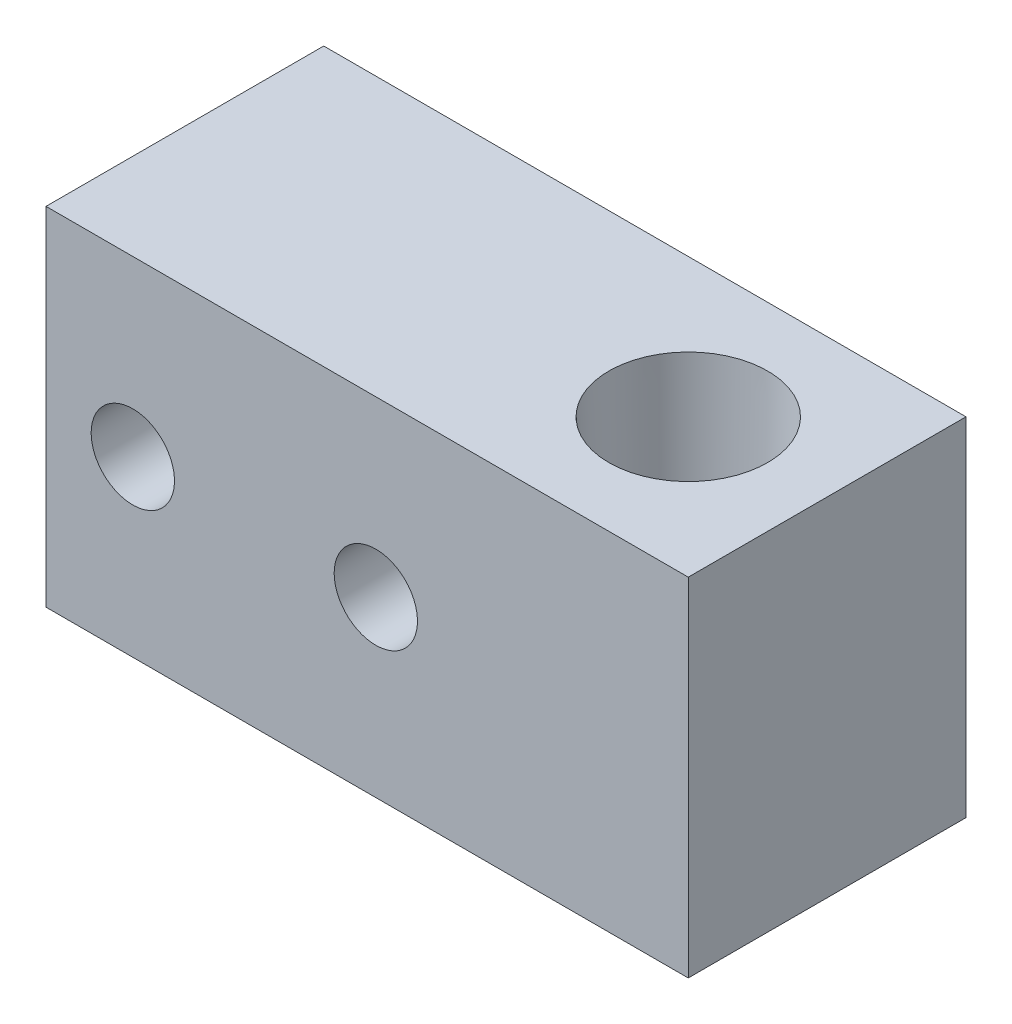
ISO-10303-21;
HEADER;
FILE_DESCRIPTION(('STEP AP214'),'2;1');
FILE_NAME('part.step','',(''),(''),'','','');
FILE_SCHEMA(('AUTOMOTIVE_DESIGN { 1 0 10303 214 1 1 1 1 }'));
ENDSEC;
DATA;
#1=APPLICATION_CONTEXT('core data for automotive mechanical design processes');
#2=APPLICATION_PROTOCOL_DEFINITION('international standard','automotive_design',2000,#1);
#3=PRODUCT_CONTEXT('',#1,'mechanical');
#4=PRODUCT('Part','Part','',(#3));
#5=PRODUCT_RELATED_PRODUCT_CATEGORY('part','',(#4));
#6=PRODUCT_DEFINITION_FORMATION('','',#4);
#7=PRODUCT_DEFINITION_CONTEXT('part definition',#1,'design');
#8=PRODUCT_DEFINITION('design','',#6,#7);
#9=PRODUCT_DEFINITION_SHAPE('','',#8);
#10=(LENGTH_UNIT() NAMED_UNIT(*) SI_UNIT(.MILLI.,.METRE.));
#11=(NAMED_UNIT(*) PLANE_ANGLE_UNIT() SI_UNIT($,.RADIAN.));
#12=(NAMED_UNIT(*) SI_UNIT($,.STERADIAN.) SOLID_ANGLE_UNIT());
#13=UNCERTAINTY_MEASURE_WITH_UNIT(LENGTH_MEASURE(1.E-05),#10,'distance_accuracy_value','');
#14=(GEOMETRIC_REPRESENTATION_CONTEXT(3) GLOBAL_UNCERTAINTY_ASSIGNED_CONTEXT((#13)) GLOBAL_UNIT_ASSIGNED_CONTEXT((#10,
#11,#12)) REPRESENTATION_CONTEXT('',''));
#15=CARTESIAN_POINT('',(0.,0.,0.));
#16=DIRECTION('',(0.,0.,1.));
#17=DIRECTION('',(1.,0.,0.));
#18=AXIS2_PLACEMENT_3D('',#15,#16,#17);
#19=CARTESIAN_POINT('',(18.5,-10.,16.));
#20=DIRECTION('',(-1.,0.,0.));
#21=DIRECTION('',(0.,0.,1.));
#22=AXIS2_PLACEMENT_3D('',#19,#20,#21);
#23=PLANE('',#22);
#24=DIRECTION('',(0.,1.,0.));
#25=VECTOR('',#24,1.);
#26=CARTESIAN_POINT('',(18.5,-10.,0.));
#27=LINE('',#26,#25);
#28=CARTESIAN_POINT('',(18.5,-10.,0.));
#29=VERTEX_POINT('',#28);
#30=CARTESIAN_POINT('',(18.5,10.,0.));
#31=VERTEX_POINT('',#30);
#32=EDGE_CURVE('E80',#29,#31,#27,.T.);
#33=ORIENTED_EDGE('',*,*,#32,.T.);
#34=DIRECTION('',(0.,0.,-1.));
#35=VECTOR('',#34,1.);
#36=CARTESIAN_POINT('',(18.5,10.,16.));
#37=LINE('',#36,#35);
#38=CARTESIAN_POINT('',(18.5,10.,16.));
#39=VERTEX_POINT('',#38);
#40=EDGE_CURVE('E11',#39,#31,#37,.T.);
#41=ORIENTED_EDGE('',*,*,#40,.F.);
#42=DIRECTION('',(0.,1.,0.));
#43=VECTOR('',#42,1.);
#44=CARTESIAN_POINT('',(18.5,-10.,16.));
#45=LINE('',#44,#43);
#46=CARTESIAN_POINT('',(18.5,-10.,16.));
#47=VERTEX_POINT('',#46);
#48=EDGE_CURVE('E68',#47,#39,#45,.T.);
#49=ORIENTED_EDGE('',*,*,#48,.F.);
#50=DIRECTION('',(0.,0.,-1.));
#51=VECTOR('',#50,1.);
#52=CARTESIAN_POINT('',(18.5,-10.,16.));
#53=LINE('',#52,#51);
#54=EDGE_CURVE('E76',#47,#29,#53,.T.);
#55=ORIENTED_EDGE('',*,*,#54,.T.);
#56=EDGE_LOOP('',(#33,#41,#49,#55));
#57=FACE_BOUND('',#56,.T.);
#58=ADVANCED_FACE('F17',(#57),#23,.F.);
#59=CARTESIAN_POINT('',(-18.5,10.,16.));
#60=DIRECTION('',(0.,-1.,0.));
#61=DIRECTION('',(0.,0.,-1.));
#62=AXIS2_PLACEMENT_3D('',#59,#60,#61);
#63=PLANE('',#62);
#64=CARTESIAN_POINT('',(10.5,10.,8.));
#65=DIRECTION('',(0.,1.,0.));
#66=DIRECTION('',(0.,0.,1.));
#67=AXIS2_PLACEMENT_3D('',#64,#65,#66);
#68=CIRCLE('',#67,4.5735);
#69=CARTESIAN_POINT('',(10.5,10.,12.5735));
#70=VERTEX_POINT('',#69);
#71=EDGE_CURVE('E132',#70,#70,#68,.T.);
#72=ORIENTED_EDGE('',*,*,#71,.F.);
#73=EDGE_LOOP('',(#72));
#74=FACE_BOUND('',#73,.T.);
#75=DIRECTION('',(-1.,0.,0.));
#76=VECTOR('',#75,1.);
#77=CARTESIAN_POINT('',(-18.5,10.,0.));
#78=LINE('',#77,#76);
#79=CARTESIAN_POINT('',(-18.5,10.,0.));
#80=VERTEX_POINT('',#79);
#81=EDGE_CURVE('E72',#31,#80,#78,.T.);
#82=ORIENTED_EDGE('',*,*,#81,.T.);
#83=DIRECTION('',(0.,0.,-1.));
#84=VECTOR('',#83,1.);
#85=CARTESIAN_POINT('',(-18.5,10.,16.));
#86=LINE('',#85,#84);
#87=CARTESIAN_POINT('',(-18.5,10.,16.));
#88=VERTEX_POINT('',#87);
#89=EDGE_CURVE('E25',#88,#80,#86,.T.);
#90=ORIENTED_EDGE('',*,*,#89,.F.);
#91=DIRECTION('',(-1.,0.,0.));
#92=VECTOR('',#91,1.);
#93=CARTESIAN_POINT('',(-18.5,10.,16.));
#94=LINE('',#93,#92);
#95=EDGE_CURVE('E63',#39,#88,#94,.T.);
#96=ORIENTED_EDGE('',*,*,#95,.F.);
#97=ORIENTED_EDGE('',*,*,#40,.T.);
#98=EDGE_LOOP('',(#82,#90,#96,#97));
#99=FACE_BOUND('',#98,.T.);
#100=ADVANCED_FACE('F71',(#74,#99),#63,.F.);
#101=CARTESIAN_POINT('',(-18.5,-10.,16.));
#102=DIRECTION('',(1.,0.,0.));
#103=DIRECTION('',(0.,0.,-1.));
#104=AXIS2_PLACEMENT_3D('',#101,#102,#103);
#105=PLANE('',#104);
#106=DIRECTION('',(0.,-1.,0.));
#107=VECTOR('',#106,1.);
#108=CARTESIAN_POINT('',(-18.5,-10.,0.));
#109=LINE('',#108,#107);
#110=CARTESIAN_POINT('',(-18.5,-10.,0.));
#111=VERTEX_POINT('',#110);
#112=EDGE_CURVE('E50',#80,#111,#109,.T.);
#113=ORIENTED_EDGE('',*,*,#112,.T.);
#114=DIRECTION('',(0.,0.,-1.));
#115=VECTOR('',#114,1.);
#116=CARTESIAN_POINT('',(-18.5,-10.,16.));
#117=LINE('',#116,#115);
#118=CARTESIAN_POINT('',(-18.5,-10.,16.));
#119=VERTEX_POINT('',#118);
#120=EDGE_CURVE('E73',#119,#111,#117,.T.);
#121=ORIENTED_EDGE('',*,*,#120,.F.);
#122=DIRECTION('',(0.,-1.,0.));
#123=VECTOR('',#122,1.);
#124=CARTESIAN_POINT('',(-18.5,-10.,16.));
#125=LINE('',#124,#123);
#126=EDGE_CURVE('E66',#88,#119,#125,.T.);
#127=ORIENTED_EDGE('',*,*,#126,.F.);
#128=ORIENTED_EDGE('',*,*,#89,.T.);
#129=EDGE_LOOP('',(#113,#121,#127,#128));
#130=FACE_BOUND('',#129,.T.);
#131=ADVANCED_FACE('F74',(#130),#105,.F.);
#132=CARTESIAN_POINT('',(-18.5,-10.,16.));
#133=DIRECTION('',(0.,1.,0.));
#134=DIRECTION('',(0.,0.,1.));
#135=AXIS2_PLACEMENT_3D('',#132,#133,#134);
#136=PLANE('',#135);
#137=CARTESIAN_POINT('',(10.5,-10.,8.));
#138=DIRECTION('',(0.,-1.,0.));
#139=DIRECTION('',(0.,0.,-1.));
#140=AXIS2_PLACEMENT_3D('',#137,#138,#139);
#141=CIRCLE('',#140,4.5735);
#142=CARTESIAN_POINT('',(10.5,-10.,3.4265));
#143=VERTEX_POINT('',#142);
#144=EDGE_CURVE('E123',#143,#143,#141,.T.);
#145=ORIENTED_EDGE('',*,*,#144,.F.);
#146=EDGE_LOOP('',(#145));
#147=FACE_BOUND('',#146,.T.);
#148=DIRECTION('',(1.,0.,0.));
#149=VECTOR('',#148,1.);
#150=CARTESIAN_POINT('',(-18.5,-10.,0.));
#151=LINE('',#150,#149);
#152=EDGE_CURVE('E56',#111,#29,#151,.T.);
#153=ORIENTED_EDGE('',*,*,#152,.T.);
#154=ORIENTED_EDGE('',*,*,#54,.F.);
#155=DIRECTION('',(1.,0.,0.));
#156=VECTOR('',#155,1.);
#157=CARTESIAN_POINT('',(-18.5,-10.,16.));
#158=LINE('',#157,#156);
#159=EDGE_CURVE('E33',#119,#47,#158,.T.);
#160=ORIENTED_EDGE('',*,*,#159,.F.);
#161=ORIENTED_EDGE('',*,*,#120,.T.);
#162=EDGE_LOOP('',(#153,#154,#160,#161));
#163=FACE_BOUND('',#162,.T.);
#164=ADVANCED_FACE('F88',(#147,#163),#136,.F.);
#165=CARTESIAN_POINT('',(0.,0.,16.));
#166=DIRECTION('',(0.,0.,-1.));
#167=DIRECTION('',(-1.,0.,0.));
#168=AXIS2_PLACEMENT_3D('',#165,#166,#167);
#169=PLANE('',#168);
#170=CARTESIAN_POINT('',(-13.5,0.,16.));
#171=DIRECTION('',(0.,0.,-1.));
#172=DIRECTION('',(-1.,0.,0.));
#173=AXIS2_PLACEMENT_3D('',#170,#171,#172);
#174=CIRCLE('',#173,2.4);
#175=CARTESIAN_POINT('',(-15.9,0.,16.));
#176=VERTEX_POINT('',#175);
#177=EDGE_CURVE('E105',#176,#176,#174,.T.);
#178=ORIENTED_EDGE('',*,*,#177,.T.);
#179=EDGE_LOOP('',(#178));
#180=FACE_BOUND('',#179,.T.);
#181=CARTESIAN_POINT('',(0.5,0.,16.));
#182=DIRECTION('',(0.,0.,-1.));
#183=DIRECTION('',(-1.,0.,0.));
#184=AXIS2_PLACEMENT_3D('',#181,#182,#183);
#185=CIRCLE('',#184,2.4);
#186=CARTESIAN_POINT('',(-1.9,0.,16.));
#187=VERTEX_POINT('',#186);
#188=EDGE_CURVE('E83',#187,#187,#185,.T.);
#189=ORIENTED_EDGE('',*,*,#188,.T.);
#190=EDGE_LOOP('',(#189));
#191=FACE_BOUND('',#190,.T.);
#192=ORIENTED_EDGE('',*,*,#48,.T.);
#193=ORIENTED_EDGE('',*,*,#95,.T.);
#194=ORIENTED_EDGE('',*,*,#126,.T.);
#195=ORIENTED_EDGE('',*,*,#159,.T.);
#196=EDGE_LOOP('',(#192,#193,#194,#195));
#197=FACE_BOUND('',#196,.T.);
#198=ADVANCED_FACE('F64',(#180,#191,#197),#169,.F.);
#199=CARTESIAN_POINT('',(0.,0.,0.));
#200=DIRECTION('',(0.,0.,-1.));
#201=DIRECTION('',(-1.,0.,0.));
#202=AXIS2_PLACEMENT_3D('',#199,#200,#201);
#203=PLANE('',#202);
#204=CARTESIAN_POINT('',(-13.5,0.,0.));
#205=DIRECTION('',(0.,0.,-1.));
#206=DIRECTION('',(-1.,0.,0.));
#207=AXIS2_PLACEMENT_3D('',#204,#205,#206);
#208=CIRCLE('',#207,4.);
#209=CARTESIAN_POINT('',(-17.5,0.,0.));
#210=VERTEX_POINT('',#209);
#211=EDGE_CURVE('E114',#210,#210,#208,.T.);
#212=ORIENTED_EDGE('',*,*,#211,.F.);
#213=EDGE_LOOP('',(#212));
#214=FACE_BOUND('',#213,.T.);
#215=CARTESIAN_POINT('',(0.5,0.,0.));
#216=DIRECTION('',(0.,0.,-1.));
#217=DIRECTION('',(-1.,0.,0.));
#218=AXIS2_PLACEMENT_3D('',#215,#216,#217);
#219=CIRCLE('',#218,4.);
#220=CARTESIAN_POINT('',(-3.5,0.,0.));
#221=VERTEX_POINT('',#220);
#222=EDGE_CURVE('E102',#221,#221,#219,.T.);
#223=ORIENTED_EDGE('',*,*,#222,.F.);
#224=EDGE_LOOP('',(#223));
#225=FACE_BOUND('',#224,.T.);
#226=ORIENTED_EDGE('',*,*,#32,.F.);
#227=ORIENTED_EDGE('',*,*,#152,.F.);
#228=ORIENTED_EDGE('',*,*,#112,.F.);
#229=ORIENTED_EDGE('',*,*,#81,.F.);
#230=EDGE_LOOP('',(#226,#227,#228,#229));
#231=FACE_BOUND('',#230,.T.);
#232=ADVANCED_FACE('F91',(#214,#225,#231),#203,.T.);
#233=CARTESIAN_POINT('',(0.5,0.,0.));
#234=DIRECTION('',(0.,0.,-1.));
#235=DIRECTION('',(-1.,0.,0.));
#236=AXIS2_PLACEMENT_3D('',#233,#234,#235);
#237=CYLINDRICAL_SURFACE('',#236,2.4);
#238=ORIENTED_EDGE('',*,*,#188,.F.);
#239=EDGE_LOOP('',(#238));
#240=FACE_BOUND('',#239,.T.);
#241=CARTESIAN_POINT('',(0.5,0.,4.6));
#242=DIRECTION('',(0.,0.,-1.));
#243=DIRECTION('',(-1.,0.,0.));
#244=AXIS2_PLACEMENT_3D('',#241,#242,#243);
#245=CIRCLE('',#244,2.4);
#246=CARTESIAN_POINT('',(-1.9,0.,4.6));
#247=VERTEX_POINT('',#246);
#248=EDGE_CURVE('E96',#247,#247,#245,.T.);
#249=ORIENTED_EDGE('',*,*,#248,.T.);
#250=EDGE_LOOP('',(#249));
#251=FACE_BOUND('',#250,.T.);
#252=ADVANCED_FACE('F151',(#240,#251),#237,.F.);
#253=CARTESIAN_POINT('',(2.9,0.,4.6));
#254=DIRECTION('',(0.,0.,1.));
#255=DIRECTION('',(1.,0.,0.));
#256=AXIS2_PLACEMENT_3D('',#253,#254,#255);
#257=PLANE('',#256);
#258=ORIENTED_EDGE('',*,*,#248,.F.);
#259=EDGE_LOOP('',(#258));
#260=FACE_BOUND('',#259,.T.);
#261=CARTESIAN_POINT('',(0.5,0.,4.6));
#262=DIRECTION('',(0.,0.,-1.));
#263=DIRECTION('',(-1.,0.,0.));
#264=AXIS2_PLACEMENT_3D('',#261,#262,#263);
#265=CIRCLE('',#264,4.);
#266=CARTESIAN_POINT('',(-3.5,0.,4.6));
#267=VERTEX_POINT('',#266);
#268=EDGE_CURVE('E99',#267,#267,#265,.T.);
#269=ORIENTED_EDGE('',*,*,#268,.T.);
#270=EDGE_LOOP('',(#269));
#271=FACE_BOUND('',#270,.T.);
#272=ADVANCED_FACE('F158',(#260,#271),#257,.F.);
#273=CARTESIAN_POINT('',(0.5,0.,0.));
#274=DIRECTION('',(0.,0.,-1.));
#275=DIRECTION('',(-1.,0.,0.));
#276=AXIS2_PLACEMENT_3D('',#273,#274,#275);
#277=CYLINDRICAL_SURFACE('',#276,4.);
#278=ORIENTED_EDGE('',*,*,#268,.F.);
#279=EDGE_LOOP('',(#278));
#280=FACE_BOUND('',#279,.T.);
#281=ORIENTED_EDGE('',*,*,#222,.T.);
#282=EDGE_LOOP('',(#281));
#283=FACE_BOUND('',#282,.T.);
#284=ADVANCED_FACE('F162',(#280,#283),#277,.F.);
#285=CARTESIAN_POINT('',(-13.5,0.,0.));
#286=DIRECTION('',(0.,0.,-1.));
#287=DIRECTION('',(-1.,0.,0.));
#288=AXIS2_PLACEMENT_3D('',#285,#286,#287);
#289=CYLINDRICAL_SURFACE('',#288,2.4);
#290=ORIENTED_EDGE('',*,*,#177,.F.);
#291=EDGE_LOOP('',(#290));
#292=FACE_BOUND('',#291,.T.);
#293=CARTESIAN_POINT('',(-13.5,0.,4.6));
#294=DIRECTION('',(0.,0.,-1.));
#295=DIRECTION('',(-1.,0.,0.));
#296=AXIS2_PLACEMENT_3D('',#293,#294,#295);
#297=CIRCLE('',#296,2.4);
#298=CARTESIAN_POINT('',(-15.9,0.,4.6));
#299=VERTEX_POINT('',#298);
#300=EDGE_CURVE('E108',#299,#299,#297,.T.);
#301=ORIENTED_EDGE('',*,*,#300,.T.);
#302=EDGE_LOOP('',(#301));
#303=FACE_BOUND('',#302,.T.);
#304=ADVANCED_FACE('F166',(#292,#303),#289,.F.);
#305=CARTESIAN_POINT('',(-11.1,0.,4.6));
#306=DIRECTION('',(0.,0.,1.));
#307=DIRECTION('',(1.,0.,0.));
#308=AXIS2_PLACEMENT_3D('',#305,#306,#307);
#309=PLANE('',#308);
#310=ORIENTED_EDGE('',*,*,#300,.F.);
#311=EDGE_LOOP('',(#310));
#312=FACE_BOUND('',#311,.T.);
#313=CARTESIAN_POINT('',(-13.5,0.,4.6));
#314=DIRECTION('',(0.,0.,-1.));
#315=DIRECTION('',(-1.,0.,0.));
#316=AXIS2_PLACEMENT_3D('',#313,#314,#315);
#317=CIRCLE('',#316,4.);
#318=CARTESIAN_POINT('',(-17.5,0.,4.6));
#319=VERTEX_POINT('',#318);
#320=EDGE_CURVE('E111',#319,#319,#317,.T.);
#321=ORIENTED_EDGE('',*,*,#320,.T.);
#322=EDGE_LOOP('',(#321));
#323=FACE_BOUND('',#322,.T.);
#324=ADVANCED_FACE('F170',(#312,#323),#309,.F.);
#325=CARTESIAN_POINT('',(-13.5,0.,0.));
#326=DIRECTION('',(0.,0.,-1.));
#327=DIRECTION('',(-1.,0.,0.));
#328=AXIS2_PLACEMENT_3D('',#325,#326,#327);
#329=CYLINDRICAL_SURFACE('',#328,4.);
#330=ORIENTED_EDGE('',*,*,#320,.F.);
#331=EDGE_LOOP('',(#330));
#332=FACE_BOUND('',#331,.T.);
#333=ORIENTED_EDGE('',*,*,#211,.T.);
#334=EDGE_LOOP('',(#333));
#335=FACE_BOUND('',#334,.T.);
#336=ADVANCED_FACE('F174',(#332,#335),#329,.F.);
#337=CARTESIAN_POINT('',(10.5,-10.,8.));
#338=DIRECTION('',(0.,-1.,0.));
#339=DIRECTION('',(0.,0.,-1.));
#340=AXIS2_PLACEMENT_3D('',#337,#338,#339);
#341=CYLINDRICAL_SURFACE('',#340,3.);
#342=CARTESIAN_POINT('',(10.5,2.6,8.));
#343=DIRECTION('',(0.,1.,0.));
#344=DIRECTION('',(0.,0.,1.));
#345=AXIS2_PLACEMENT_3D('',#342,#343,#344);
#346=CIRCLE('',#345,3.);
#347=CARTESIAN_POINT('',(10.5,2.6,11.));
#348=VERTEX_POINT('',#347);
#349=EDGE_CURVE('E126',#348,#348,#346,.T.);
#350=ORIENTED_EDGE('',*,*,#349,.T.);
#351=EDGE_LOOP('',(#350));
#352=FACE_BOUND('',#351,.T.);
#353=CARTESIAN_POINT('',(10.5,-2.6,8.));
#354=DIRECTION('',(0.,-1.,0.));
#355=DIRECTION('',(0.,0.,-1.));
#356=AXIS2_PLACEMENT_3D('',#353,#354,#355);
#357=CIRCLE('',#356,3.);
#358=CARTESIAN_POINT('',(10.5,-2.6,5.));
#359=VERTEX_POINT('',#358);
#360=EDGE_CURVE('E117',#359,#359,#357,.T.);
#361=ORIENTED_EDGE('',*,*,#360,.T.);
#362=EDGE_LOOP('',(#361));
#363=FACE_BOUND('',#362,.T.);
#364=ADVANCED_FACE('F178',(#352,#363),#341,.F.);
#365=CARTESIAN_POINT('',(13.5,-2.6,8.));
#366=DIRECTION('',(0.,1.,0.));
#367=DIRECTION('',(0.,0.,1.));
#368=AXIS2_PLACEMENT_3D('',#365,#366,#367);
#369=PLANE('',#368);
#370=ORIENTED_EDGE('',*,*,#360,.F.);
#371=EDGE_LOOP('',(#370));
#372=FACE_BOUND('',#371,.T.);
#373=CARTESIAN_POINT('',(10.5,-2.6,8.));
#374=DIRECTION('',(0.,-1.,0.));
#375=DIRECTION('',(0.,0.,-1.));
#376=AXIS2_PLACEMENT_3D('',#373,#374,#375);
#377=CIRCLE('',#376,4.34249700411669);
#378=CARTESIAN_POINT('',(10.5,-2.6,3.65750299588331));
#379=VERTEX_POINT('',#378);
#380=EDGE_CURVE('E120',#379,#379,#377,.T.);
#381=ORIENTED_EDGE('',*,*,#380,.T.);
#382=EDGE_LOOP('',(#381));
#383=FACE_BOUND('',#382,.T.);
#384=ADVANCED_FACE('F182',(#372,#383),#369,.F.);
#385=CARTESIAN_POINT('',(10.5,-10.,8.));
#386=DIRECTION('',(0.,-1.,0.));
#387=DIRECTION('',(0.,0.,-1.));
#388=AXIS2_PLACEMENT_3D('',#385,#386,#387);
#389=CONICAL_SURFACE('',#388,4.5735,0.0312064870256585);
#390=ORIENTED_EDGE('',*,*,#380,.F.);
#391=EDGE_LOOP('',(#390));
#392=FACE_BOUND('',#391,.T.);
#393=ORIENTED_EDGE('',*,*,#144,.T.);
#394=EDGE_LOOP('',(#393));
#395=FACE_BOUND('',#394,.T.);
#396=ADVANCED_FACE('F186',(#392,#395),#389,.F.);
#397=CARTESIAN_POINT('',(13.5,2.6,8.));
#398=DIRECTION('',(0.,-1.,0.));
#399=DIRECTION('',(0.,0.,-1.));
#400=AXIS2_PLACEMENT_3D('',#397,#398,#399);
#401=PLANE('',#400);
#402=ORIENTED_EDGE('',*,*,#349,.F.);
#403=EDGE_LOOP('',(#402));
#404=FACE_BOUND('',#403,.T.);
#405=CARTESIAN_POINT('',(10.5,2.6,8.));
#406=DIRECTION('',(0.,1.,0.));
#407=DIRECTION('',(0.,0.,1.));
#408=AXIS2_PLACEMENT_3D('',#405,#406,#407);
#409=CIRCLE('',#408,4.34249700411669);
#410=CARTESIAN_POINT('',(10.5,2.6,12.3424970041167));
#411=VERTEX_POINT('',#410);
#412=EDGE_CURVE('E129',#411,#411,#409,.T.);
#413=ORIENTED_EDGE('',*,*,#412,.T.);
#414=EDGE_LOOP('',(#413));
#415=FACE_BOUND('',#414,.T.);
#416=ADVANCED_FACE('F190',(#404,#415),#401,.F.);
#417=CARTESIAN_POINT('',(10.5,10.,8.));
#418=DIRECTION('',(0.,1.,0.));
#419=DIRECTION('',(0.,0.,1.));
#420=AXIS2_PLACEMENT_3D('',#417,#418,#419);
#421=CONICAL_SURFACE('',#420,4.5735,0.0312064870256583);
#422=ORIENTED_EDGE('',*,*,#412,.F.);
#423=EDGE_LOOP('',(#422));
#424=FACE_BOUND('',#423,.T.);
#425=ORIENTED_EDGE('',*,*,#71,.T.);
#426=EDGE_LOOP('',(#425));
#427=FACE_BOUND('',#426,.T.);
#428=ADVANCED_FACE('F136',(#424,#427),#421,.F.);
#429=CLOSED_SHELL('',(#58,#100,#131,#164,#198,#232,#252,#272,#284,#304,#324,#336,#364,#384,#396,
#416,#428));
#430=MANIFOLD_SOLID_BREP('B1',#429);
#431=ADVANCED_BREP_SHAPE_REPRESENTATION('',(#18,#430),#14);
#432=SHAPE_DEFINITION_REPRESENTATION(#9,#431);
ENDSEC;
END-ISO-10303-21;
